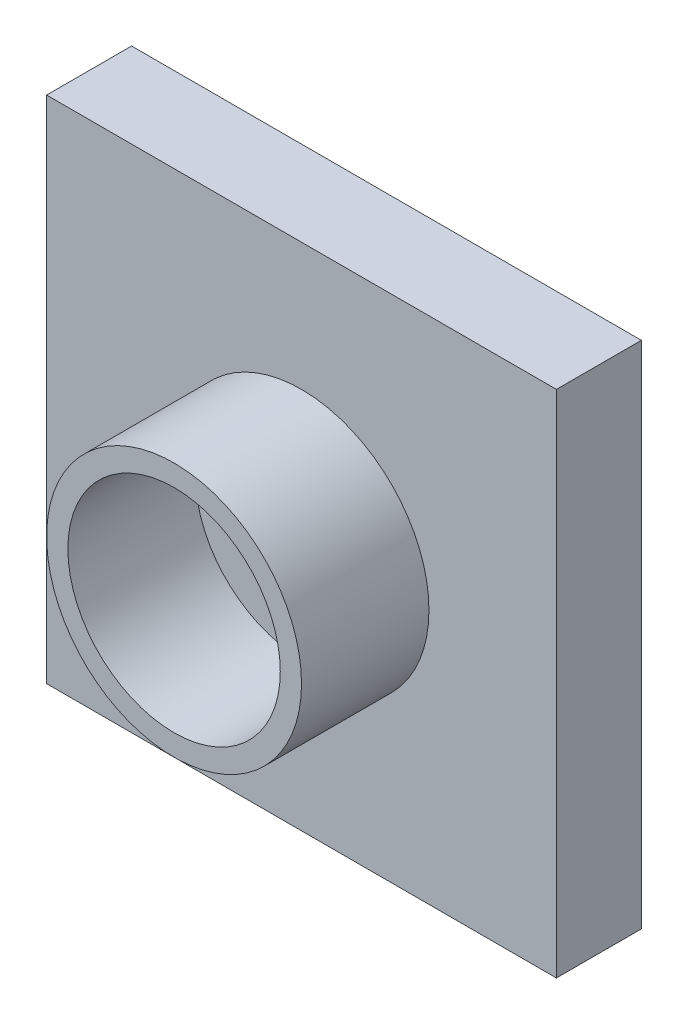
ISO-10303-21;
HEADER;
FILE_DESCRIPTION(('STEP AP214'),'2;1');
FILE_NAME('part.step','',(''),(''),'','','');
FILE_SCHEMA(('AUTOMOTIVE_DESIGN { 1 0 10303 214 1 1 1 1 }'));
ENDSEC;
DATA;
#1=APPLICATION_CONTEXT('core data for automotive mechanical design processes');
#2=APPLICATION_PROTOCOL_DEFINITION('international standard','automotive_design',2000,#1);
#3=PRODUCT_CONTEXT('',#1,'mechanical');
#4=PRODUCT('Part','Part','',(#3));
#5=PRODUCT_RELATED_PRODUCT_CATEGORY('part','',(#4));
#6=PRODUCT_DEFINITION_FORMATION('','',#4);
#7=PRODUCT_DEFINITION_CONTEXT('part definition',#1,'design');
#8=PRODUCT_DEFINITION('design','',#6,#7);
#9=PRODUCT_DEFINITION_SHAPE('','',#8);
#10=(LENGTH_UNIT() NAMED_UNIT(*) SI_UNIT(.MILLI.,.METRE.));
#11=(NAMED_UNIT(*) PLANE_ANGLE_UNIT() SI_UNIT($,.RADIAN.));
#12=(NAMED_UNIT(*) SI_UNIT($,.STERADIAN.) SOLID_ANGLE_UNIT());
#13=UNCERTAINTY_MEASURE_WITH_UNIT(LENGTH_MEASURE(1.E-05),#10,'distance_accuracy_value','');
#14=(GEOMETRIC_REPRESENTATION_CONTEXT(3) GLOBAL_UNCERTAINTY_ASSIGNED_CONTEXT((#13)) GLOBAL_UNIT_ASSIGNED_CONTEXT((#10,
#11,#12)) REPRESENTATION_CONTEXT('',''));
#15=CARTESIAN_POINT('',(0.,0.,0.));
#16=DIRECTION('',(0.,0.,1.));
#17=DIRECTION('',(1.,0.,0.));
#18=AXIS2_PLACEMENT_3D('',#15,#16,#17);
#19=CARTESIAN_POINT('',(6.,6.,2.));
#20=DIRECTION('',(-1.,0.,0.));
#21=DIRECTION('',(0.,-1.,0.));
#22=AXIS2_PLACEMENT_3D('',#19,#20,#21);
#23=PLANE('',#22);
#24=DIRECTION('',(0.,1.,0.));
#25=VECTOR('',#24,1.);
#26=CARTESIAN_POINT('',(6.,6.,0.));
#27=LINE('',#26,#25);
#28=CARTESIAN_POINT('',(6.,-6.,0.));
#29=VERTEX_POINT('',#28);
#30=CARTESIAN_POINT('',(6.,6.,0.));
#31=VERTEX_POINT('',#30);
#32=EDGE_CURVE('E105',#29,#31,#27,.T.);
#33=ORIENTED_EDGE('',*,*,#32,.T.);
#34=DIRECTION('',(0.,0.,-1.));
#35=VECTOR('',#34,1.);
#36=CARTESIAN_POINT('',(6.,6.,2.));
#37=LINE('',#36,#35);
#38=CARTESIAN_POINT('',(6.,6.,2.));
#39=VERTEX_POINT('',#38);
#40=EDGE_CURVE('E47',#39,#31,#37,.T.);
#41=ORIENTED_EDGE('',*,*,#40,.F.);
#42=DIRECTION('',(0.,1.,0.));
#43=VECTOR('',#42,1.);
#44=CARTESIAN_POINT('',(6.,6.,2.));
#45=LINE('',#44,#43);
#46=CARTESIAN_POINT('',(6.,-6.,2.));
#47=VERTEX_POINT('',#46);
#48=EDGE_CURVE('E91',#47,#39,#45,.T.);
#49=ORIENTED_EDGE('',*,*,#48,.F.);
#50=DIRECTION('',(0.,0.,-1.));
#51=VECTOR('',#50,1.);
#52=CARTESIAN_POINT('',(6.,-6.,2.));
#53=LINE('',#52,#51);
#54=EDGE_CURVE('E101',#47,#29,#53,.T.);
#55=ORIENTED_EDGE('',*,*,#54,.T.);
#56=EDGE_LOOP('',(#33,#41,#49,#55));
#57=FACE_BOUND('',#56,.T.);
#58=ADVANCED_FACE('F39',(#57),#23,.F.);
#59=CARTESIAN_POINT('',(-6.,6.,2.));
#60=DIRECTION('',(0.,-1.,0.));
#61=DIRECTION('',(0.,0.,-1.));
#62=AXIS2_PLACEMENT_3D('',#59,#60,#61);
#63=PLANE('',#62);
#64=DIRECTION('',(-1.,0.,0.));
#65=VECTOR('',#64,1.);
#66=CARTESIAN_POINT('',(-6.,6.,0.));
#67=LINE('',#66,#65);
#68=CARTESIAN_POINT('',(-6.,6.,0.));
#69=VERTEX_POINT('',#68);
#70=EDGE_CURVE('E96',#31,#69,#67,.T.);
#71=ORIENTED_EDGE('',*,*,#70,.T.);
#72=DIRECTION('',(0.,0.,-1.));
#73=VECTOR('',#72,1.);
#74=CARTESIAN_POINT('',(-6.,6.,2.));
#75=LINE('',#74,#73);
#76=CARTESIAN_POINT('',(-6.,6.,2.));
#77=VERTEX_POINT('',#76);
#78=EDGE_CURVE('E94',#77,#69,#75,.T.);
#79=ORIENTED_EDGE('',*,*,#78,.F.);
#80=DIRECTION('',(-1.,0.,0.));
#81=VECTOR('',#80,1.);
#82=CARTESIAN_POINT('',(-6.,6.,2.));
#83=LINE('',#82,#81);
#84=EDGE_CURVE('E86',#39,#77,#83,.T.);
#85=ORIENTED_EDGE('',*,*,#84,.F.);
#86=ORIENTED_EDGE('',*,*,#40,.T.);
#87=EDGE_LOOP('',(#71,#79,#85,#86));
#88=FACE_BOUND('',#87,.T.);
#89=ADVANCED_FACE('F95',(#88),#63,.F.);
#90=CARTESIAN_POINT('',(-6.,6.,2.));
#91=DIRECTION('',(1.,0.,0.));
#92=DIRECTION('',(0.,1.,0.));
#93=AXIS2_PLACEMENT_3D('',#90,#91,#92);
#94=PLANE('',#93);
#95=DIRECTION('',(0.,-1.,0.));
#96=VECTOR('',#95,1.);
#97=CARTESIAN_POINT('',(-6.,6.,0.));
#98=LINE('',#97,#96);
#99=CARTESIAN_POINT('',(-6.,-6.,0.));
#100=VERTEX_POINT('',#99);
#101=EDGE_CURVE('E72',#69,#100,#98,.T.);
#102=ORIENTED_EDGE('',*,*,#101,.T.);
#103=DIRECTION('',(0.,0.,-1.));
#104=VECTOR('',#103,1.);
#105=CARTESIAN_POINT('',(-6.,-6.,2.));
#106=LINE('',#105,#104);
#107=CARTESIAN_POINT('',(-6.,-6.,2.));
#108=VERTEX_POINT('',#107);
#109=EDGE_CURVE('E97',#108,#100,#106,.T.);
#110=ORIENTED_EDGE('',*,*,#109,.F.);
#111=DIRECTION('',(0.,-1.,0.));
#112=VECTOR('',#111,1.);
#113=CARTESIAN_POINT('',(-6.,6.,2.));
#114=LINE('',#113,#112);
#115=EDGE_CURVE('E89',#77,#108,#114,.T.);
#116=ORIENTED_EDGE('',*,*,#115,.F.);
#117=ORIENTED_EDGE('',*,*,#78,.T.);
#118=EDGE_LOOP('',(#102,#110,#116,#117));
#119=FACE_BOUND('',#118,.T.);
#120=ADVANCED_FACE('F99',(#119),#94,.F.);
#121=CARTESIAN_POINT('',(-6.,-6.,2.));
#122=DIRECTION('',(0.,1.,0.));
#123=DIRECTION('',(0.,0.,1.));
#124=AXIS2_PLACEMENT_3D('',#121,#122,#123);
#125=PLANE('',#124);
#126=DIRECTION('',(1.,0.,0.));
#127=VECTOR('',#126,1.);
#128=CARTESIAN_POINT('',(-6.,-6.,0.));
#129=LINE('',#128,#127);
#130=EDGE_CURVE('E78',#100,#29,#129,.T.);
#131=ORIENTED_EDGE('',*,*,#130,.T.);
#132=ORIENTED_EDGE('',*,*,#54,.F.);
#133=DIRECTION('',(1.,0.,0.));
#134=VECTOR('',#133,1.);
#135=CARTESIAN_POINT('',(-6.,-6.,2.));
#136=LINE('',#135,#134);
#137=EDGE_CURVE('E55',#108,#47,#136,.T.);
#138=ORIENTED_EDGE('',*,*,#137,.F.);
#139=ORIENTED_EDGE('',*,*,#109,.T.);
#140=EDGE_LOOP('',(#131,#132,#138,#139));
#141=FACE_BOUND('',#140,.T.);
#142=ADVANCED_FACE('F130',(#141),#125,.F.);
#143=CARTESIAN_POINT('',(0.,0.,2.));
#144=DIRECTION('',(0.,0.,1.));
#145=DIRECTION('',(1.,0.,0.));
#146=AXIS2_PLACEMENT_3D('',#143,#144,#145);
#147=PLANE('',#146);
#148=CARTESIAN_POINT('',(0.,0.,2.));
#149=DIRECTION('',(0.,0.,1.));
#150=DIRECTION('',(1.,0.,0.));
#151=AXIS2_PLACEMENT_3D('',#148,#149,#150);
#152=CIRCLE('',#151,3.);
#153=CARTESIAN_POINT('',(3.,0.,2.));
#154=VERTEX_POINT('',#153);
#155=EDGE_CURVE('E230',#154,#154,#152,.T.);
#156=ORIENTED_EDGE('',*,*,#155,.F.);
#157=EDGE_LOOP('',(#156));
#158=FACE_BOUND('',#157,.T.);
#159=ORIENTED_EDGE('',*,*,#48,.T.);
#160=ORIENTED_EDGE('',*,*,#84,.T.);
#161=ORIENTED_EDGE('',*,*,#115,.T.);
#162=ORIENTED_EDGE('',*,*,#137,.T.);
#163=EDGE_LOOP('',(#159,#160,#161,#162));
#164=FACE_BOUND('',#163,.T.);
#165=ADVANCED_FACE('F87',(#158,#164),#147,.T.);
#166=CARTESIAN_POINT('',(0.,0.,0.));
#167=DIRECTION('',(0.,0.,1.));
#168=DIRECTION('',(1.,0.,0.));
#169=AXIS2_PLACEMENT_3D('',#166,#167,#168);
#170=PLANE('',#169);
#171=CARTESIAN_POINT('',(0.,0.,0.));
#172=DIRECTION('',(0.,0.,1.));
#173=DIRECTION('',(1.,0.,0.));
#174=AXIS2_PLACEMENT_3D('',#171,#172,#173);
#175=CIRCLE('',#174,1.);
#176=CARTESIAN_POINT('',(1.,0.,0.));
#177=VERTEX_POINT('',#176);
#178=EDGE_CURVE('E223',#177,#177,#175,.T.);
#179=ORIENTED_EDGE('',*,*,#178,.T.);
#180=EDGE_LOOP('',(#179));
#181=FACE_BOUND('',#180,.T.);
#182=ORIENTED_EDGE('',*,*,#32,.F.);
#183=ORIENTED_EDGE('',*,*,#130,.F.);
#184=ORIENTED_EDGE('',*,*,#101,.F.);
#185=ORIENTED_EDGE('',*,*,#70,.F.);
#186=EDGE_LOOP('',(#182,#183,#184,#185));
#187=FACE_BOUND('',#186,.T.);
#188=ADVANCED_FACE('F116',(#181,#187),#170,.F.);
#189=CARTESIAN_POINT('',(0.,0.,5.));
#190=DIRECTION('',(0.,0.,1.));
#191=DIRECTION('',(1.,0.,0.));
#192=AXIS2_PLACEMENT_3D('',#189,#190,#191);
#193=PLANE('',#192);
#194=CARTESIAN_POINT('',(0.,0.,5.));
#195=DIRECTION('',(0.,0.,1.));
#196=DIRECTION('',(1.,0.,0.));
#197=AXIS2_PLACEMENT_3D('',#194,#195,#196);
#198=CIRCLE('',#197,3.);
#199=CARTESIAN_POINT('',(3.,0.,5.));
#200=VERTEX_POINT('',#199);
#201=EDGE_CURVE('E108',#200,#200,#198,.T.);
#202=ORIENTED_EDGE('',*,*,#201,.T.);
#203=EDGE_LOOP('',(#202));
#204=FACE_BOUND('',#203,.T.);
#205=CARTESIAN_POINT('',(0.,0.,5.));
#206=DIRECTION('',(0.,0.,1.));
#207=DIRECTION('',(1.,0.,0.));
#208=AXIS2_PLACEMENT_3D('',#205,#206,#207);
#209=CIRCLE('',#208,2.5);
#210=CARTESIAN_POINT('',(2.5,0.,5.));
#211=VERTEX_POINT('',#210);
#212=EDGE_CURVE('E225',#211,#211,#209,.T.);
#213=ORIENTED_EDGE('',*,*,#212,.F.);
#214=EDGE_LOOP('',(#213));
#215=FACE_BOUND('',#214,.T.);
#216=ADVANCED_FACE('F118',(#204,#215),#193,.T.);
#217=CARTESIAN_POINT('',(0.,0.,5.));
#218=DIRECTION('',(0.,0.,-1.));
#219=DIRECTION('',(-1.,0.,0.));
#220=AXIS2_PLACEMENT_3D('',#217,#218,#219);
#221=CYLINDRICAL_SURFACE('',#220,3.);
#222=ORIENTED_EDGE('',*,*,#201,.F.);
#223=EDGE_LOOP('',(#222));
#224=FACE_BOUND('',#223,.T.);
#225=ORIENTED_EDGE('',*,*,#155,.T.);
#226=EDGE_LOOP('',(#225));
#227=FACE_BOUND('',#226,.T.);
#228=ADVANCED_FACE('F126',(#224,#227),#221,.T.);
#229=CARTESIAN_POINT('',(0.,0.,5.));
#230=DIRECTION('',(0.,0.,-1.));
#231=DIRECTION('',(-1.,0.,0.));
#232=AXIS2_PLACEMENT_3D('',#229,#230,#231);
#233=CYLINDRICAL_SURFACE('',#232,2.5);
#234=ORIENTED_EDGE('',*,*,#212,.T.);
#235=EDGE_LOOP('',(#234));
#236=FACE_BOUND('',#235,.T.);
#237=CARTESIAN_POINT('',(0.,0.,2.));
#238=DIRECTION('',(0.,0.,1.));
#239=DIRECTION('',(1.,0.,0.));
#240=AXIS2_PLACEMENT_3D('',#237,#238,#239);
#241=CIRCLE('',#240,2.5);
#242=CARTESIAN_POINT('',(2.5,0.,2.));
#243=VERTEX_POINT('',#242);
#244=EDGE_CURVE('E11',#243,#243,#241,.F.);
#245=ORIENTED_EDGE('',*,*,#244,.T.);
#246=EDGE_LOOP('',(#245));
#247=FACE_BOUND('',#246,.T.);
#248=ADVANCED_FACE('F166',(#236,#247),#233,.F.);
#249=CARTESIAN_POINT('',(0.,0.,2.));
#250=DIRECTION('',(0.,0.,1.));
#251=DIRECTION('',(1.,0.,0.));
#252=AXIS2_PLACEMENT_3D('',#249,#250,#251);
#253=CIRCLE('',#252,1.);
#254=CARTESIAN_POINT('',(1.,0.,2.));
#255=VERTEX_POINT('',#254);
#256=EDGE_CURVE('E219',#255,#255,#253,.T.);
#257=ORIENTED_EDGE('',*,*,#256,.F.);
#258=EDGE_LOOP('',(#257));
#259=FACE_BOUND('',#258,.T.);
#260=ORIENTED_EDGE('',*,*,#244,.F.);
#261=EDGE_LOOP('',(#260));
#262=FACE_BOUND('',#261,.T.);
#263=ADVANCED_FACE('F133',(#259,#262),#147,.T.);
#264=CARTESIAN_POINT('',(0.,0.,0.));
#265=DIRECTION('',(0.,0.,1.));
#266=DIRECTION('',(1.,0.,0.));
#267=AXIS2_PLACEMENT_3D('',#264,#265,#266);
#268=CYLINDRICAL_SURFACE('',#267,1.);
#269=ORIENTED_EDGE('',*,*,#178,.F.);
#270=EDGE_LOOP('',(#269));
#271=FACE_BOUND('',#270,.T.);
#272=ORIENTED_EDGE('',*,*,#256,.T.);
#273=EDGE_LOOP('',(#272));
#274=FACE_BOUND('',#273,.T.);
#275=ADVANCED_FACE('F182',(#271,#274),#268,.F.);
#276=CLOSED_SHELL('',(#58,#89,#120,#142,#165,#188,#216,#228,#248,#263,#275));
#277=MANIFOLD_SOLID_BREP('B2',#276);
#278=ADVANCED_BREP_SHAPE_REPRESENTATION('',(#18,#277),#14);
#279=SHAPE_DEFINITION_REPRESENTATION(#9,#278);
ENDSEC;
END-ISO-10303-21;
